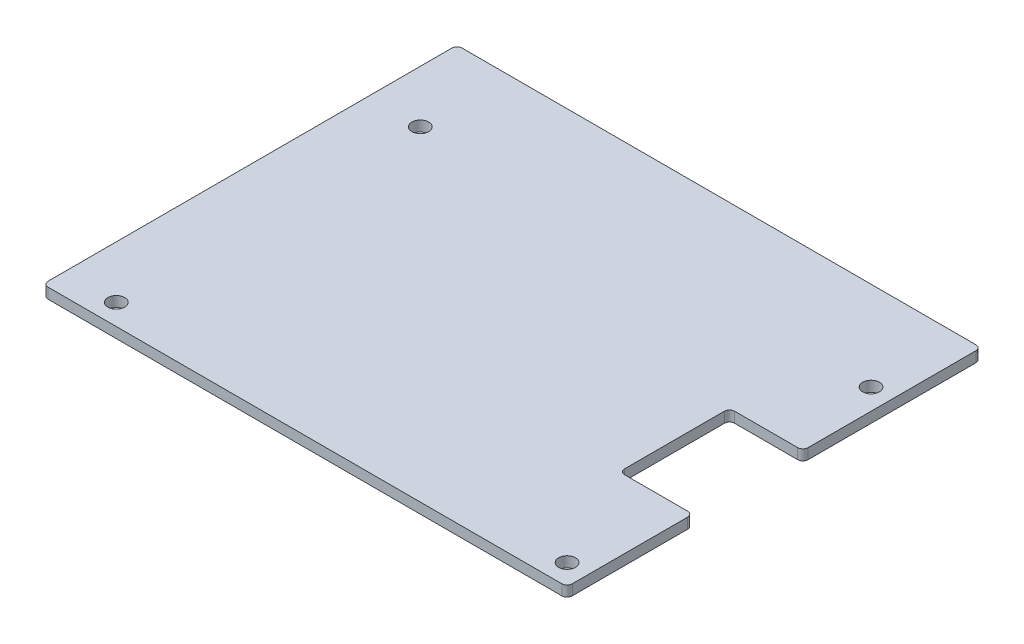
ISO-10303-21;
HEADER;
FILE_DESCRIPTION(('STEP AP214'),'2;1');
FILE_NAME('part.step','',(''),(''),'','','');
FILE_SCHEMA(('AUTOMOTIVE_DESIGN { 1 0 10303 214 1 1 1 1 }'));
ENDSEC;
DATA;
#1=APPLICATION_CONTEXT('core data for automotive mechanical design processes');
#2=APPLICATION_PROTOCOL_DEFINITION('international standard','automotive_design',2000,#1);
#3=PRODUCT_CONTEXT('',#1,'mechanical');
#4=PRODUCT('Part','Part','',(#3));
#5=PRODUCT_RELATED_PRODUCT_CATEGORY('part','',(#4));
#6=PRODUCT_DEFINITION_FORMATION('','',#4);
#7=PRODUCT_DEFINITION_CONTEXT('part definition',#1,'design');
#8=PRODUCT_DEFINITION('design','',#6,#7);
#9=PRODUCT_DEFINITION_SHAPE('','',#8);
#10=(LENGTH_UNIT() NAMED_UNIT(*) SI_UNIT(.MILLI.,.METRE.));
#11=(NAMED_UNIT(*) PLANE_ANGLE_UNIT() SI_UNIT($,.RADIAN.));
#12=(NAMED_UNIT(*) SI_UNIT($,.STERADIAN.) SOLID_ANGLE_UNIT());
#13=UNCERTAINTY_MEASURE_WITH_UNIT(LENGTH_MEASURE(1.E-05),#10,'distance_accuracy_value','');
#14=(GEOMETRIC_REPRESENTATION_CONTEXT(3) GLOBAL_UNCERTAINTY_ASSIGNED_CONTEXT((#13)) GLOBAL_UNIT_ASSIGNED_CONTEXT((#10,
#11,#12)) REPRESENTATION_CONTEXT('',''));
#15=CARTESIAN_POINT('',(0.,0.,0.));
#16=DIRECTION('',(0.,0.,1.));
#17=DIRECTION('',(1.,0.,0.));
#18=AXIS2_PLACEMENT_3D('',#15,#16,#17);
#19=CARTESIAN_POINT('',(0.,2.,0.));
#20=DIRECTION('',(0.,-1.,0.));
#21=DIRECTION('',(0.,0.,-1.));
#22=AXIS2_PLACEMENT_3D('',#19,#20,#21);
#23=PLANE('',#22);
#24=DIRECTION('',(-1.,0.,0.));
#25=VECTOR('',#24,1.);
#26=CARTESIAN_POINT('',(50.,2.,-5.5));
#27=LINE('',#26,#25);
#28=CARTESIAN_POINT('',(49.,2.,-5.5));
#29=VERTEX_POINT('',#28);
#30=CARTESIAN_POINT('',(37.,2.,-5.5));
#31=VERTEX_POINT('',#30);
#32=EDGE_CURVE('E167',#29,#31,#27,.T.);
#33=ORIENTED_EDGE('',*,*,#32,.F.);
#34=CARTESIAN_POINT('',(49.,2.,-6.5));
#35=DIRECTION('',(0.,-1.,0.));
#36=DIRECTION('',(0.,0.,-1.));
#37=AXIS2_PLACEMENT_3D('',#34,#35,#36);
#38=CIRCLE('',#37,1.);
#39=CARTESIAN_POINT('',(50.,2.,-6.5));
#40=VERTEX_POINT('',#39);
#41=EDGE_CURVE('E150',#29,#40,#38,.F.);
#42=ORIENTED_EDGE('',*,*,#41,.T.);
#43=DIRECTION('',(0.,0.,-1.));
#44=VECTOR('',#43,1.);
#45=CARTESIAN_POINT('',(50.,2.,39.5));
#46=LINE('',#45,#44);
#47=CARTESIAN_POINT('',(50.,2.,-38.5));
#48=VERTEX_POINT('',#47);
#49=EDGE_CURVE('E190',#40,#48,#46,.T.);
#50=ORIENTED_EDGE('',*,*,#49,.T.);
#51=CARTESIAN_POINT('',(49.,2.,-38.5));
#52=DIRECTION('',(0.,-1.,0.));
#53=DIRECTION('',(0.,0.,-1.));
#54=AXIS2_PLACEMENT_3D('',#51,#52,#53);
#55=CIRCLE('',#54,1.);
#56=CARTESIAN_POINT('',(49.,2.,-39.5));
#57=VERTEX_POINT('',#56);
#58=EDGE_CURVE('E218',#48,#57,#55,.F.);
#59=ORIENTED_EDGE('',*,*,#58,.T.);
#60=DIRECTION('',(-1.,0.,0.));
#61=VECTOR('',#60,1.);
#62=CARTESIAN_POINT('',(-50.,2.,-39.5));
#63=LINE('',#62,#61);
#64=CARTESIAN_POINT('',(-49.,2.,-39.5));
#65=VERTEX_POINT('',#64);
#66=EDGE_CURVE('E194',#57,#65,#63,.T.);
#67=ORIENTED_EDGE('',*,*,#66,.T.);
#68=CARTESIAN_POINT('',(-49.,2.,-38.5));
#69=DIRECTION('',(0.,-1.,0.));
#70=DIRECTION('',(0.,0.,-1.));
#71=AXIS2_PLACEMENT_3D('',#68,#69,#70);
#72=CIRCLE('',#71,1.);
#73=CARTESIAN_POINT('',(-50.,2.,-38.5));
#74=VERTEX_POINT('',#73);
#75=EDGE_CURVE('E220',#65,#74,#72,.F.);
#76=ORIENTED_EDGE('',*,*,#75,.T.);
#77=DIRECTION('',(0.,0.,1.));
#78=VECTOR('',#77,1.);
#79=CARTESIAN_POINT('',(-50.,2.,39.5));
#80=LINE('',#79,#78);
#81=CARTESIAN_POINT('',(-50.,2.,38.5));
#82=VERTEX_POINT('',#81);
#83=EDGE_CURVE('E197',#74,#82,#80,.T.);
#84=ORIENTED_EDGE('',*,*,#83,.T.);
#85=CARTESIAN_POINT('',(-49.,2.,38.5));
#86=DIRECTION('',(0.,-1.,0.));
#87=DIRECTION('',(0.,0.,-1.));
#88=AXIS2_PLACEMENT_3D('',#85,#86,#87);
#89=CIRCLE('',#88,1.);
#90=CARTESIAN_POINT('',(-49.,2.,39.5));
#91=VERTEX_POINT('',#90);
#92=EDGE_CURVE('E170',#82,#91,#89,.F.);
#93=ORIENTED_EDGE('',*,*,#92,.T.);
#94=DIRECTION('',(1.,0.,0.));
#95=VECTOR('',#94,1.);
#96=CARTESIAN_POINT('',(-50.,2.,39.5));
#97=LINE('',#96,#95);
#98=CARTESIAN_POINT('',(49.,2.,39.5));
#99=VERTEX_POINT('',#98);
#100=EDGE_CURVE('E200',#91,#99,#97,.T.);
#101=ORIENTED_EDGE('',*,*,#100,.T.);
#102=CARTESIAN_POINT('',(49.,2.,38.5));
#103=DIRECTION('',(0.,-1.,0.));
#104=DIRECTION('',(0.,0.,-1.));
#105=AXIS2_PLACEMENT_3D('',#102,#103,#104);
#106=CIRCLE('',#105,1.);
#107=CARTESIAN_POINT('',(50.,2.,38.5));
#108=VERTEX_POINT('',#107);
#109=EDGE_CURVE('E216',#99,#108,#106,.F.);
#110=ORIENTED_EDGE('',*,*,#109,.T.);
#111=CARTESIAN_POINT('',(50.,2.,16.5));
#112=VERTEX_POINT('',#111);
#113=EDGE_CURVE('E192',#108,#112,#46,.T.);
#114=ORIENTED_EDGE('',*,*,#113,.T.);
#115=CARTESIAN_POINT('',(49.,2.,16.5));
#116=DIRECTION('',(0.,-1.,0.));
#117=DIRECTION('',(0.,0.,-1.));
#118=AXIS2_PLACEMENT_3D('',#115,#116,#117);
#119=CIRCLE('',#118,1.);
#120=CARTESIAN_POINT('',(49.,2.,15.5));
#121=VERTEX_POINT('',#120);
#122=EDGE_CURVE('E161',#112,#121,#119,.F.);
#123=ORIENTED_EDGE('',*,*,#122,.T.);
#124=DIRECTION('',(1.,0.,0.));
#125=VECTOR('',#124,1.);
#126=CARTESIAN_POINT('',(50.,2.,15.5));
#127=LINE('',#126,#125);
#128=CARTESIAN_POINT('',(37.,2.,15.5));
#129=VERTEX_POINT('',#128);
#130=EDGE_CURVE('E179',#129,#121,#127,.T.);
#131=ORIENTED_EDGE('',*,*,#130,.F.);
#132=CARTESIAN_POINT('',(37.,2.,14.5));
#133=DIRECTION('',(0.,-1.,0.));
#134=DIRECTION('',(0.,0.,-1.));
#135=AXIS2_PLACEMENT_3D('',#132,#133,#134);
#136=CIRCLE('',#135,1.);
#137=CARTESIAN_POINT('',(36.,2.,14.5));
#138=VERTEX_POINT('',#137);
#139=EDGE_CURVE('E44',#129,#138,#136,.T.);
#140=ORIENTED_EDGE('',*,*,#139,.T.);
#141=DIRECTION('',(0.,0.,1.));
#142=VECTOR('',#141,1.);
#143=CARTESIAN_POINT('',(36.,2.,15.5));
#144=LINE('',#143,#142);
#145=CARTESIAN_POINT('',(36.,2.,-4.5));
#146=VERTEX_POINT('',#145);
#147=EDGE_CURVE('E176',#146,#138,#144,.T.);
#148=ORIENTED_EDGE('',*,*,#147,.F.);
#149=CARTESIAN_POINT('',(37.,2.,-4.5));
#150=DIRECTION('',(0.,-1.,0.));
#151=DIRECTION('',(0.,0.,-1.));
#152=AXIS2_PLACEMENT_3D('',#149,#150,#151);
#153=CIRCLE('',#152,1.);
#154=EDGE_CURVE('E175',#146,#31,#153,.T.);
#155=ORIENTED_EDGE('',*,*,#154,.T.);
#156=EDGE_LOOP('',(#33,#42,#50,#59,#67,#76,#84,#93,#101,#110,#114,#123,#131,#140,#148,#155));
#157=FACE_BOUND('',#156,.T.);
#158=CARTESIAN_POINT('',(46.,2.,-22.5));
#159=DIRECTION('',(0.,1.,0.));
#160=DIRECTION('',(0.,0.,1.));
#161=AXIS2_PLACEMENT_3D('',#158,#159,#160);
#162=CIRCLE('',#161,1.6);
#163=CARTESIAN_POINT('',(46.,2.,-20.9));
#164=VERTEX_POINT('',#163);
#165=EDGE_CURVE('E530',#164,#164,#162,.T.);
#166=ORIENTED_EDGE('',*,*,#165,.F.);
#167=EDGE_LOOP('',(#166));
#168=FACE_BOUND('',#167,.T.);
#169=CARTESIAN_POINT('',(-40.,2.,35.5));
#170=DIRECTION('',(0.,1.,0.));
#171=DIRECTION('',(0.,0.,1.));
#172=AXIS2_PLACEMENT_3D('',#169,#170,#171);
#173=CIRCLE('',#172,1.6);
#174=CARTESIAN_POINT('',(-40.,2.,37.1));
#175=VERTEX_POINT('',#174);
#176=EDGE_CURVE('E524',#175,#175,#173,.T.);
#177=ORIENTED_EDGE('',*,*,#176,.F.);
#178=EDGE_LOOP('',(#177));
#179=FACE_BOUND('',#178,.T.);
#180=CARTESIAN_POINT('',(46.,2.,35.5));
#181=DIRECTION('',(0.,1.,0.));
#182=DIRECTION('',(0.,0.,1.));
#183=AXIS2_PLACEMENT_3D('',#180,#181,#182);
#184=CIRCLE('',#183,1.6);
#185=CARTESIAN_POINT('',(46.,2.,37.1));
#186=VERTEX_POINT('',#185);
#187=EDGE_CURVE('E515',#186,#186,#184,.T.);
#188=ORIENTED_EDGE('',*,*,#187,.F.);
#189=EDGE_LOOP('',(#188));
#190=FACE_BOUND('',#189,.T.);
#191=CARTESIAN_POINT('',(-40.,2.,-22.5));
#192=DIRECTION('',(0.,1.,0.));
#193=DIRECTION('',(0.,0.,1.));
#194=AXIS2_PLACEMENT_3D('',#191,#192,#193);
#195=CIRCLE('',#194,1.6);
#196=CARTESIAN_POINT('',(-40.,2.,-20.9));
#197=VERTEX_POINT('',#196);
#198=EDGE_CURVE('E511',#197,#197,#195,.T.);
#199=ORIENTED_EDGE('',*,*,#198,.F.);
#200=EDGE_LOOP('',(#199));
#201=FACE_BOUND('',#200,.T.);
#202=ADVANCED_FACE('F36',(#157,#168,#179,#190,#201),#23,.F.);
#203=CARTESIAN_POINT('',(50.,2.,39.5));
#204=DIRECTION('',(-1.,0.,0.));
#205=DIRECTION('',(0.,0.,1.));
#206=AXIS2_PLACEMENT_3D('',#203,#204,#205);
#207=PLANE('',#206);
#208=DIRECTION('',(0.,0.,-1.));
#209=VECTOR('',#208,1.);
#210=CARTESIAN_POINT('',(50.,0.,39.5));
#211=LINE('',#210,#209);
#212=CARTESIAN_POINT('',(50.,0.,38.5));
#213=VERTEX_POINT('',#212);
#214=CARTESIAN_POINT('',(50.,0.,16.5));
#215=VERTEX_POINT('',#214);
#216=EDGE_CURVE('E203',#213,#215,#211,.T.);
#217=ORIENTED_EDGE('',*,*,#216,.T.);
#218=DIRECTION('',(0.,1.,0.));
#219=VECTOR('',#218,1.);
#220=CARTESIAN_POINT('',(50.,2.,16.5));
#221=LINE('',#220,#219);
#222=EDGE_CURVE('E249',#215,#112,#221,.T.);
#223=ORIENTED_EDGE('',*,*,#222,.T.);
#224=ORIENTED_EDGE('',*,*,#113,.F.);
#225=DIRECTION('',(0.,-1.,0.));
#226=VECTOR('',#225,1.);
#227=CARTESIAN_POINT('',(50.,2.,38.5));
#228=LINE('',#227,#226);
#229=EDGE_CURVE('E246',#108,#213,#228,.T.);
#230=ORIENTED_EDGE('',*,*,#229,.T.);
#231=EDGE_LOOP('',(#217,#223,#224,#230));
#232=FACE_BOUND('',#231,.T.);
#233=ADVANCED_FACE('F287',(#232),#207,.F.);
#234=ORIENTED_EDGE('',*,*,#49,.F.);
#235=DIRECTION('',(0.,1.,0.));
#236=VECTOR('',#235,1.);
#237=CARTESIAN_POINT('',(50.,2.,-6.5));
#238=LINE('',#237,#236);
#239=CARTESIAN_POINT('',(50.,0.,-6.5));
#240=VERTEX_POINT('',#239);
#241=EDGE_CURVE('E155',#40,#240,#238,.F.);
#242=ORIENTED_EDGE('',*,*,#241,.T.);
#243=CARTESIAN_POINT('',(50.,0.,-38.5));
#244=VERTEX_POINT('',#243);
#245=EDGE_CURVE('E189',#240,#244,#211,.T.);
#246=ORIENTED_EDGE('',*,*,#245,.T.);
#247=DIRECTION('',(0.,-1.,0.));
#248=VECTOR('',#247,1.);
#249=CARTESIAN_POINT('',(50.,2.,-38.5));
#250=LINE('',#249,#248);
#251=EDGE_CURVE('E160',#244,#48,#250,.F.);
#252=ORIENTED_EDGE('',*,*,#251,.T.);
#253=EDGE_LOOP('',(#234,#242,#246,#252));
#254=FACE_BOUND('',#253,.T.);
#255=ADVANCED_FACE('F323',(#254),#207,.F.);
#256=CARTESIAN_POINT('',(-50.,2.,-39.5));
#257=DIRECTION('',(0.,0.,1.));
#258=DIRECTION('',(1.,0.,0.));
#259=AXIS2_PLACEMENT_3D('',#256,#257,#258);
#260=PLANE('',#259);
#261=DIRECTION('',(-1.,0.,0.));
#262=VECTOR('',#261,1.);
#263=CARTESIAN_POINT('',(-50.,0.,-39.5));
#264=LINE('',#263,#262);
#265=CARTESIAN_POINT('',(49.,0.,-39.5));
#266=VERTEX_POINT('',#265);
#267=CARTESIAN_POINT('',(-49.,0.,-39.5));
#268=VERTEX_POINT('',#267);
#269=EDGE_CURVE('E206',#266,#268,#264,.T.);
#270=ORIENTED_EDGE('',*,*,#269,.T.);
#271=DIRECTION('',(0.,-1.,0.));
#272=VECTOR('',#271,1.);
#273=CARTESIAN_POINT('',(-49.,2.,-39.5));
#274=LINE('',#273,#272);
#275=EDGE_CURVE('E260',#268,#65,#274,.F.);
#276=ORIENTED_EDGE('',*,*,#275,.T.);
#277=ORIENTED_EDGE('',*,*,#66,.F.);
#278=DIRECTION('',(0.,-1.,0.));
#279=VECTOR('',#278,1.);
#280=CARTESIAN_POINT('',(49.,2.,-39.5));
#281=LINE('',#280,#279);
#282=EDGE_CURVE('E257',#57,#266,#281,.T.);
#283=ORIENTED_EDGE('',*,*,#282,.T.);
#284=EDGE_LOOP('',(#270,#276,#277,#283));
#285=FACE_BOUND('',#284,.T.);
#286=ADVANCED_FACE('F314',(#285),#260,.F.);
#287=CARTESIAN_POINT('',(-50.,2.,39.5));
#288=DIRECTION('',(1.,0.,0.));
#289=DIRECTION('',(0.,0.,-1.));
#290=AXIS2_PLACEMENT_3D('',#287,#288,#289);
#291=PLANE('',#290);
#292=ORIENTED_EDGE('',*,*,#83,.F.);
#293=DIRECTION('',(0.,-1.,0.));
#294=VECTOR('',#293,1.);
#295=CARTESIAN_POINT('',(-50.,2.,-38.5));
#296=LINE('',#295,#294);
#297=CARTESIAN_POINT('',(-50.,0.,-38.5));
#298=VERTEX_POINT('',#297);
#299=EDGE_CURVE('E254',#74,#298,#296,.T.);
#300=ORIENTED_EDGE('',*,*,#299,.T.);
#301=DIRECTION('',(0.,0.,1.));
#302=VECTOR('',#301,1.);
#303=CARTESIAN_POINT('',(-50.,0.,39.5));
#304=LINE('',#303,#302);
#305=CARTESIAN_POINT('',(-50.,0.,38.5));
#306=VERTEX_POINT('',#305);
#307=EDGE_CURVE('E209',#298,#306,#304,.T.);
#308=ORIENTED_EDGE('',*,*,#307,.T.);
#309=DIRECTION('',(0.,-1.,0.));
#310=VECTOR('',#309,1.);
#311=CARTESIAN_POINT('',(-50.,2.,38.5));
#312=LINE('',#311,#310);
#313=EDGE_CURVE('E252',#306,#82,#312,.F.);
#314=ORIENTED_EDGE('',*,*,#313,.T.);
#315=EDGE_LOOP('',(#292,#300,#308,#314));
#316=FACE_BOUND('',#315,.T.);
#317=ADVANCED_FACE('F306',(#316),#291,.F.);
#318=CARTESIAN_POINT('',(-50.,2.,39.5));
#319=DIRECTION('',(0.,0.,-1.));
#320=DIRECTION('',(-1.,0.,0.));
#321=AXIS2_PLACEMENT_3D('',#318,#319,#320);
#322=PLANE('',#321);
#323=DIRECTION('',(1.,0.,0.));
#324=VECTOR('',#323,1.);
#325=CARTESIAN_POINT('',(-50.,0.,39.5));
#326=LINE('',#325,#324);
#327=CARTESIAN_POINT('',(-49.,0.,39.5));
#328=VERTEX_POINT('',#327);
#329=CARTESIAN_POINT('',(49.,0.,39.5));
#330=VERTEX_POINT('',#329);
#331=EDGE_CURVE('E193',#328,#330,#326,.T.);
#332=ORIENTED_EDGE('',*,*,#331,.T.);
#333=DIRECTION('',(0.,-1.,0.));
#334=VECTOR('',#333,1.);
#335=CARTESIAN_POINT('',(49.,2.,39.5));
#336=LINE('',#335,#334);
#337=EDGE_CURVE('E265',#330,#99,#336,.F.);
#338=ORIENTED_EDGE('',*,*,#337,.T.);
#339=ORIENTED_EDGE('',*,*,#100,.F.);
#340=DIRECTION('',(0.,-1.,0.));
#341=VECTOR('',#340,1.);
#342=CARTESIAN_POINT('',(-49.,2.,39.5));
#343=LINE('',#342,#341);
#344=EDGE_CURVE('E262',#91,#328,#343,.T.);
#345=ORIENTED_EDGE('',*,*,#344,.T.);
#346=EDGE_LOOP('',(#332,#338,#339,#345));
#347=FACE_BOUND('',#346,.T.);
#348=ADVANCED_FACE('F297',(#347),#322,.F.);
#349=CARTESIAN_POINT('',(0.,0.,0.));
#350=DIRECTION('',(0.,-1.,0.));
#351=DIRECTION('',(0.,0.,-1.));
#352=AXIS2_PLACEMENT_3D('',#349,#350,#351);
#353=PLANE('',#352);
#354=CARTESIAN_POINT('',(-40.,0.,-22.5));
#355=DIRECTION('',(0.,-1.,0.));
#356=DIRECTION('',(0.,0.,-1.));
#357=AXIS2_PLACEMENT_3D('',#354,#355,#356);
#358=CIRCLE('',#357,1.6);
#359=CARTESIAN_POINT('',(-40.,0.,-24.1));
#360=VERTEX_POINT('',#359);
#361=EDGE_CURVE('E514',#360,#360,#358,.T.);
#362=ORIENTED_EDGE('',*,*,#361,.F.);
#363=EDGE_LOOP('',(#362));
#364=FACE_BOUND('',#363,.T.);
#365=CARTESIAN_POINT('',(46.,0.,35.5));
#366=DIRECTION('',(0.,-1.,0.));
#367=DIRECTION('',(0.,0.,-1.));
#368=AXIS2_PLACEMENT_3D('',#365,#366,#367);
#369=CIRCLE('',#368,1.6);
#370=CARTESIAN_POINT('',(46.,0.,33.9));
#371=VERTEX_POINT('',#370);
#372=EDGE_CURVE('E518',#371,#371,#369,.T.);
#373=ORIENTED_EDGE('',*,*,#372,.F.);
#374=EDGE_LOOP('',(#373));
#375=FACE_BOUND('',#374,.T.);
#376=CARTESIAN_POINT('',(-40.,0.,35.5));
#377=DIRECTION('',(0.,-1.,0.));
#378=DIRECTION('',(0.,0.,-1.));
#379=AXIS2_PLACEMENT_3D('',#376,#377,#378);
#380=CIRCLE('',#379,1.6);
#381=CARTESIAN_POINT('',(-40.,0.,33.9));
#382=VERTEX_POINT('',#381);
#383=EDGE_CURVE('E527',#382,#382,#380,.T.);
#384=ORIENTED_EDGE('',*,*,#383,.F.);
#385=EDGE_LOOP('',(#384));
#386=FACE_BOUND('',#385,.T.);
#387=CARTESIAN_POINT('',(46.,0.,-22.5));
#388=DIRECTION('',(0.,-1.,0.));
#389=DIRECTION('',(0.,0.,-1.));
#390=AXIS2_PLACEMENT_3D('',#387,#388,#389);
#391=CIRCLE('',#390,1.6);
#392=CARTESIAN_POINT('',(46.,0.,-24.1));
#393=VERTEX_POINT('',#392);
#394=EDGE_CURVE('E533',#393,#393,#391,.T.);
#395=ORIENTED_EDGE('',*,*,#394,.F.);
#396=EDGE_LOOP('',(#395));
#397=FACE_BOUND('',#396,.T.);
#398=ORIENTED_EDGE('',*,*,#245,.F.);
#399=CARTESIAN_POINT('',(49.,0.,-6.5));
#400=DIRECTION('',(0.,-1.,0.));
#401=DIRECTION('',(0.,0.,-1.));
#402=AXIS2_PLACEMENT_3D('',#399,#400,#401);
#403=CIRCLE('',#402,1.);
#404=CARTESIAN_POINT('',(49.,0.,-5.5));
#405=VERTEX_POINT('',#404);
#406=EDGE_CURVE('E235',#240,#405,#403,.T.);
#407=ORIENTED_EDGE('',*,*,#406,.T.);
#408=DIRECTION('',(-1.,0.,0.));
#409=VECTOR('',#408,1.);
#410=CARTESIAN_POINT('',(50.,0.,-5.5));
#411=LINE('',#410,#409);
#412=CARTESIAN_POINT('',(37.,0.,-5.5));
#413=VERTEX_POINT('',#412);
#414=EDGE_CURVE('E169',#405,#413,#411,.T.);
#415=ORIENTED_EDGE('',*,*,#414,.T.);
#416=CARTESIAN_POINT('',(37.,0.,-4.5));
#417=DIRECTION('',(0.,-1.,0.));
#418=DIRECTION('',(0.,0.,-1.));
#419=AXIS2_PLACEMENT_3D('',#416,#417,#418);
#420=CIRCLE('',#419,1.);
#421=CARTESIAN_POINT('',(36.,0.,-4.5));
#422=VERTEX_POINT('',#421);
#423=EDGE_CURVE('E58',#413,#422,#420,.F.);
#424=ORIENTED_EDGE('',*,*,#423,.T.);
#425=DIRECTION('',(0.,0.,1.));
#426=VECTOR('',#425,1.);
#427=CARTESIAN_POINT('',(36.,0.,15.5));
#428=LINE('',#427,#426);
#429=CARTESIAN_POINT('',(36.,0.,14.5));
#430=VERTEX_POINT('',#429);
#431=EDGE_CURVE('E182',#422,#430,#428,.T.);
#432=ORIENTED_EDGE('',*,*,#431,.T.);
#433=CARTESIAN_POINT('',(37.,0.,14.5));
#434=DIRECTION('',(0.,-1.,0.));
#435=DIRECTION('',(0.,0.,-1.));
#436=AXIS2_PLACEMENT_3D('',#433,#434,#435);
#437=CIRCLE('',#436,1.);
#438=CARTESIAN_POINT('',(37.,0.,15.5));
#439=VERTEX_POINT('',#438);
#440=EDGE_CURVE('E11',#430,#439,#437,.F.);
#441=ORIENTED_EDGE('',*,*,#440,.T.);
#442=DIRECTION('',(1.,0.,0.));
#443=VECTOR('',#442,1.);
#444=CARTESIAN_POINT('',(50.,0.,15.5));
#445=LINE('',#444,#443);
#446=CARTESIAN_POINT('',(49.,0.,15.5));
#447=VERTEX_POINT('',#446);
#448=EDGE_CURVE('E177',#439,#447,#445,.T.);
#449=ORIENTED_EDGE('',*,*,#448,.T.);
#450=CARTESIAN_POINT('',(49.,0.,16.5));
#451=DIRECTION('',(0.,-1.,0.));
#452=DIRECTION('',(0.,0.,-1.));
#453=AXIS2_PLACEMENT_3D('',#450,#451,#452);
#454=CIRCLE('',#453,1.);
#455=EDGE_CURVE('E233',#447,#215,#454,.T.);
#456=ORIENTED_EDGE('',*,*,#455,.T.);
#457=ORIENTED_EDGE('',*,*,#216,.F.);
#458=CARTESIAN_POINT('',(49.,0.,38.5));
#459=DIRECTION('',(0.,-1.,0.));
#460=DIRECTION('',(0.,0.,-1.));
#461=AXIS2_PLACEMENT_3D('',#458,#459,#460);
#462=CIRCLE('',#461,1.);
#463=EDGE_CURVE('E227',#213,#330,#462,.T.);
#464=ORIENTED_EDGE('',*,*,#463,.T.);
#465=ORIENTED_EDGE('',*,*,#331,.F.);
#466=CARTESIAN_POINT('',(-49.,0.,38.5));
#467=DIRECTION('',(0.,-1.,0.));
#468=DIRECTION('',(0.,0.,-1.));
#469=AXIS2_PLACEMENT_3D('',#466,#467,#468);
#470=CIRCLE('',#469,1.);
#471=EDGE_CURVE('E225',#328,#306,#470,.T.);
#472=ORIENTED_EDGE('',*,*,#471,.T.);
#473=ORIENTED_EDGE('',*,*,#307,.F.);
#474=CARTESIAN_POINT('',(-49.,0.,-38.5));
#475=DIRECTION('',(0.,-1.,0.));
#476=DIRECTION('',(0.,0.,-1.));
#477=AXIS2_PLACEMENT_3D('',#474,#475,#476);
#478=CIRCLE('',#477,1.);
#479=EDGE_CURVE('E231',#298,#268,#478,.T.);
#480=ORIENTED_EDGE('',*,*,#479,.T.);
#481=ORIENTED_EDGE('',*,*,#269,.F.);
#482=CARTESIAN_POINT('',(49.,0.,-38.5));
#483=DIRECTION('',(0.,-1.,0.));
#484=DIRECTION('',(0.,0.,-1.));
#485=AXIS2_PLACEMENT_3D('',#482,#483,#484);
#486=CIRCLE('',#485,1.);
#487=EDGE_CURVE('E229',#266,#244,#486,.T.);
#488=ORIENTED_EDGE('',*,*,#487,.T.);
#489=EDGE_LOOP('',(#398,#407,#415,#424,#432,#441,#449,#456,#457,#464,#465,#472,#473,#480,#481,#488));
#490=FACE_BOUND('',#489,.T.);
#491=ADVANCED_FACE('F277',(#364,#375,#386,#397,#490),#353,.T.);
#492=CARTESIAN_POINT('',(50.,-0.00100000000000013,15.5));
#493=DIRECTION('',(0.,0.,1.));
#494=DIRECTION('',(1.,0.,0.));
#495=AXIS2_PLACEMENT_3D('',#492,#493,#494);
#496=PLANE('',#495);
#497=ORIENTED_EDGE('',*,*,#448,.F.);
#498=DIRECTION('',(0.,1.,0.));
#499=VECTOR('',#498,1.);
#500=CARTESIAN_POINT('',(37.,2.,15.5));
#501=LINE('',#500,#499);
#502=EDGE_CURVE('E243',#439,#129,#501,.T.);
#503=ORIENTED_EDGE('',*,*,#502,.T.);
#504=ORIENTED_EDGE('',*,*,#130,.T.);
#505=DIRECTION('',(0.,1.,0.));
#506=VECTOR('',#505,1.);
#507=CARTESIAN_POINT('',(49.,-0.00100000000000013,15.5));
#508=LINE('',#507,#506);
#509=EDGE_CURVE('E241',#121,#447,#508,.F.);
#510=ORIENTED_EDGE('',*,*,#509,.T.);
#511=EDGE_LOOP('',(#497,#503,#504,#510));
#512=FACE_BOUND('',#511,.T.);
#513=ADVANCED_FACE('F280',(#512),#496,.F.);
#514=CARTESIAN_POINT('',(36.,-0.00100000000000013,15.5));
#515=DIRECTION('',(-1.,0.,0.));
#516=DIRECTION('',(0.,0.,1.));
#517=AXIS2_PLACEMENT_3D('',#514,#515,#516);
#518=PLANE('',#517);
#519=ORIENTED_EDGE('',*,*,#431,.F.);
#520=DIRECTION('',(0.,1.,0.));
#521=VECTOR('',#520,1.);
#522=CARTESIAN_POINT('',(36.,2.,-4.5));
#523=LINE('',#522,#521);
#524=EDGE_CURVE('E238',#422,#146,#523,.T.);
#525=ORIENTED_EDGE('',*,*,#524,.T.);
#526=ORIENTED_EDGE('',*,*,#147,.T.);
#527=DIRECTION('',(0.,1.,0.));
#528=VECTOR('',#527,1.);
#529=CARTESIAN_POINT('',(36.,0.,14.5));
#530=LINE('',#529,#528);
#531=EDGE_CURVE('E51',#138,#430,#530,.F.);
#532=ORIENTED_EDGE('',*,*,#531,.T.);
#533=EDGE_LOOP('',(#519,#525,#526,#532));
#534=FACE_BOUND('',#533,.T.);
#535=ADVANCED_FACE('F271',(#534),#518,.F.);
#536=CARTESIAN_POINT('',(50.,-0.00100000000000013,-5.5));
#537=DIRECTION('',(0.,0.,-1.));
#538=DIRECTION('',(-1.,0.,0.));
#539=AXIS2_PLACEMENT_3D('',#536,#537,#538);
#540=PLANE('',#539);
#541=ORIENTED_EDGE('',*,*,#414,.F.);
#542=DIRECTION('',(0.,1.,0.));
#543=VECTOR('',#542,1.);
#544=CARTESIAN_POINT('',(49.,-0.00100000000000013,-5.5));
#545=LINE('',#544,#543);
#546=EDGE_CURVE('E154',#405,#29,#545,.T.);
#547=ORIENTED_EDGE('',*,*,#546,.T.);
#548=ORIENTED_EDGE('',*,*,#32,.T.);
#549=DIRECTION('',(0.,1.,0.));
#550=VECTOR('',#549,1.);
#551=CARTESIAN_POINT('',(37.,0.,-5.5));
#552=LINE('',#551,#550);
#553=EDGE_CURVE('E171',#31,#413,#552,.F.);
#554=ORIENTED_EDGE('',*,*,#553,.T.);
#555=EDGE_LOOP('',(#541,#547,#548,#554));
#556=FACE_BOUND('',#555,.T.);
#557=ADVANCED_FACE('F166',(#556),#540,.F.);
#558=CARTESIAN_POINT('',(49.,-0.00100000000000013,-6.5));
#559=DIRECTION('',(0.,1.,0.));
#560=DIRECTION('',(0.,0.,1.));
#561=AXIS2_PLACEMENT_3D('',#558,#559,#560);
#562=CYLINDRICAL_SURFACE('',#561,1.);
#563=ORIENTED_EDGE('',*,*,#406,.F.);
#564=ORIENTED_EDGE('',*,*,#241,.F.);
#565=ORIENTED_EDGE('',*,*,#41,.F.);
#566=ORIENTED_EDGE('',*,*,#546,.F.);
#567=EDGE_LOOP('',(#563,#564,#565,#566));
#568=FACE_BOUND('',#567,.T.);
#569=ADVANCED_FACE('F153',(#568),#562,.T.);
#570=CARTESIAN_POINT('',(37.,-0.00100000000000013,-4.5));
#571=DIRECTION('',(0.,-1.,0.));
#572=DIRECTION('',(0.,0.,-1.));
#573=AXIS2_PLACEMENT_3D('',#570,#571,#572);
#574=CYLINDRICAL_SURFACE('',#573,1.);
#575=ORIENTED_EDGE('',*,*,#423,.F.);
#576=ORIENTED_EDGE('',*,*,#553,.F.);
#577=ORIENTED_EDGE('',*,*,#154,.F.);
#578=ORIENTED_EDGE('',*,*,#524,.F.);
#579=EDGE_LOOP('',(#575,#576,#577,#578));
#580=FACE_BOUND('',#579,.T.);
#581=ADVANCED_FACE('F380',(#580),#574,.F.);
#582=CARTESIAN_POINT('',(37.,-0.00100000000000013,14.5));
#583=DIRECTION('',(0.,-1.,0.));
#584=DIRECTION('',(0.,0.,-1.));
#585=AXIS2_PLACEMENT_3D('',#582,#583,#584);
#586=CYLINDRICAL_SURFACE('',#585,1.);
#587=ORIENTED_EDGE('',*,*,#440,.F.);
#588=ORIENTED_EDGE('',*,*,#531,.F.);
#589=ORIENTED_EDGE('',*,*,#139,.F.);
#590=ORIENTED_EDGE('',*,*,#502,.F.);
#591=EDGE_LOOP('',(#587,#588,#589,#590));
#592=FACE_BOUND('',#591,.T.);
#593=ADVANCED_FACE('F274',(#592),#586,.F.);
#594=CARTESIAN_POINT('',(49.,2.,16.5));
#595=DIRECTION('',(0.,1.,0.));
#596=DIRECTION('',(0.,0.,1.));
#597=AXIS2_PLACEMENT_3D('',#594,#595,#596);
#598=CYLINDRICAL_SURFACE('',#597,1.);
#599=ORIENTED_EDGE('',*,*,#455,.F.);
#600=ORIENTED_EDGE('',*,*,#509,.F.);
#601=ORIENTED_EDGE('',*,*,#122,.F.);
#602=ORIENTED_EDGE('',*,*,#222,.F.);
#603=EDGE_LOOP('',(#599,#600,#601,#602));
#604=FACE_BOUND('',#603,.T.);
#605=ADVANCED_FACE('F283',(#604),#598,.T.);
#606=CARTESIAN_POINT('',(-49.,2.,-38.5));
#607=DIRECTION('',(0.,-1.,0.));
#608=DIRECTION('',(0.,0.,-1.));
#609=AXIS2_PLACEMENT_3D('',#606,#607,#608);
#610=CYLINDRICAL_SURFACE('',#609,1.);
#611=ORIENTED_EDGE('',*,*,#75,.F.);
#612=ORIENTED_EDGE('',*,*,#275,.F.);
#613=ORIENTED_EDGE('',*,*,#479,.F.);
#614=ORIENTED_EDGE('',*,*,#299,.F.);
#615=EDGE_LOOP('',(#611,#612,#613,#614));
#616=FACE_BOUND('',#615,.T.);
#617=ADVANCED_FACE('F310',(#616),#610,.T.);
#618=CARTESIAN_POINT('',(49.,2.,-38.5));
#619=DIRECTION('',(0.,-1.,0.));
#620=DIRECTION('',(0.,0.,-1.));
#621=AXIS2_PLACEMENT_3D('',#618,#619,#620);
#622=CYLINDRICAL_SURFACE('',#621,1.);
#623=ORIENTED_EDGE('',*,*,#58,.F.);
#624=ORIENTED_EDGE('',*,*,#251,.F.);
#625=ORIENTED_EDGE('',*,*,#487,.F.);
#626=ORIENTED_EDGE('',*,*,#282,.F.);
#627=EDGE_LOOP('',(#623,#624,#625,#626));
#628=FACE_BOUND('',#627,.T.);
#629=ADVANCED_FACE('F319',(#628),#622,.T.);
#630=CARTESIAN_POINT('',(49.,2.,38.5));
#631=DIRECTION('',(0.,-1.,0.));
#632=DIRECTION('',(0.,0.,-1.));
#633=AXIS2_PLACEMENT_3D('',#630,#631,#632);
#634=CYLINDRICAL_SURFACE('',#633,1.);
#635=ORIENTED_EDGE('',*,*,#109,.F.);
#636=ORIENTED_EDGE('',*,*,#337,.F.);
#637=ORIENTED_EDGE('',*,*,#463,.F.);
#638=ORIENTED_EDGE('',*,*,#229,.F.);
#639=EDGE_LOOP('',(#635,#636,#637,#638));
#640=FACE_BOUND('',#639,.T.);
#641=ADVANCED_FACE('F293',(#640),#634,.T.);
#642=CARTESIAN_POINT('',(-49.,2.,38.5));
#643=DIRECTION('',(0.,-1.,0.));
#644=DIRECTION('',(0.,0.,-1.));
#645=AXIS2_PLACEMENT_3D('',#642,#643,#644);
#646=CYLINDRICAL_SURFACE('',#645,1.);
#647=ORIENTED_EDGE('',*,*,#92,.F.);
#648=ORIENTED_EDGE('',*,*,#313,.F.);
#649=ORIENTED_EDGE('',*,*,#471,.F.);
#650=ORIENTED_EDGE('',*,*,#344,.F.);
#651=EDGE_LOOP('',(#647,#648,#649,#650));
#652=FACE_BOUND('',#651,.T.);
#653=ADVANCED_FACE('F38',(#652),#646,.T.);
#654=CARTESIAN_POINT('',(46.,2.,-22.5));
#655=DIRECTION('',(0.,1.,0.));
#656=DIRECTION('',(0.,0.,1.));
#657=AXIS2_PLACEMENT_3D('',#654,#655,#656);
#658=CYLINDRICAL_SURFACE('',#657,1.6);
#659=ORIENTED_EDGE('',*,*,#165,.T.);
#660=EDGE_LOOP('',(#659));
#661=FACE_BOUND('',#660,.T.);
#662=ORIENTED_EDGE('',*,*,#394,.T.);
#663=EDGE_LOOP('',(#662));
#664=FACE_BOUND('',#663,.T.);
#665=ADVANCED_FACE('F422',(#661,#664),#658,.F.);
#666=CARTESIAN_POINT('',(-40.,2.,35.5));
#667=DIRECTION('',(0.,1.,0.));
#668=DIRECTION('',(0.,0.,1.));
#669=AXIS2_PLACEMENT_3D('',#666,#667,#668);
#670=CYLINDRICAL_SURFACE('',#669,1.6);
#671=ORIENTED_EDGE('',*,*,#176,.T.);
#672=EDGE_LOOP('',(#671));
#673=FACE_BOUND('',#672,.T.);
#674=ORIENTED_EDGE('',*,*,#383,.T.);
#675=EDGE_LOOP('',(#674));
#676=FACE_BOUND('',#675,.T.);
#677=ADVANCED_FACE('F427',(#673,#676),#670,.F.);
#678=CARTESIAN_POINT('',(46.,2.,35.5));
#679=DIRECTION('',(0.,1.,0.));
#680=DIRECTION('',(0.,0.,1.));
#681=AXIS2_PLACEMENT_3D('',#678,#679,#680);
#682=CYLINDRICAL_SURFACE('',#681,1.6);
#683=ORIENTED_EDGE('',*,*,#187,.T.);
#684=EDGE_LOOP('',(#683));
#685=FACE_BOUND('',#684,.T.);
#686=ORIENTED_EDGE('',*,*,#372,.T.);
#687=EDGE_LOOP('',(#686));
#688=FACE_BOUND('',#687,.T.);
#689=ADVANCED_FACE('F435',(#685,#688),#682,.F.);
#690=CARTESIAN_POINT('',(-40.,2.,-22.5));
#691=DIRECTION('',(0.,1.,0.));
#692=DIRECTION('',(0.,0.,1.));
#693=AXIS2_PLACEMENT_3D('',#690,#691,#692);
#694=CYLINDRICAL_SURFACE('',#693,1.6);
#695=ORIENTED_EDGE('',*,*,#198,.T.);
#696=EDGE_LOOP('',(#695));
#697=FACE_BOUND('',#696,.T.);
#698=ORIENTED_EDGE('',*,*,#361,.T.);
#699=EDGE_LOOP('',(#698));
#700=FACE_BOUND('',#699,.T.);
#701=ADVANCED_FACE('F443',(#697,#700),#694,.F.);
#702=CLOSED_SHELL('',(#202,#233,#255,#286,#317,#348,#491,#513,#535,#557,#569,#581,#593,#605,
#617,#629,#641,#653,#665,#677,#689,#701));
#703=MANIFOLD_SOLID_BREP('B2',#702);
#704=ADVANCED_BREP_SHAPE_REPRESENTATION('',(#18,#703),#14);
#705=SHAPE_DEFINITION_REPRESENTATION(#9,#704);
ENDSEC;
END-ISO-10303-21;
